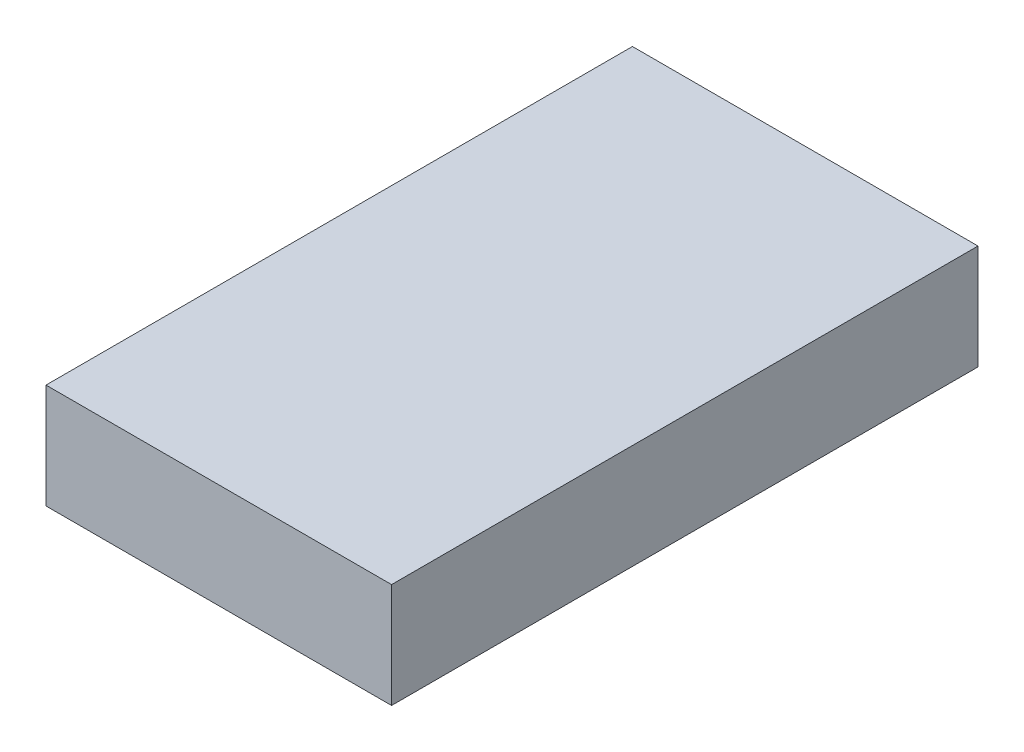
ISO-10303-21;
HEADER;
FILE_DESCRIPTION(('STEP AP214'),'2;1');
FILE_NAME('part.step','',(''),(''),'','','');
FILE_SCHEMA(('AUTOMOTIVE_DESIGN { 1 0 10303 214 1 1 1 1 }'));
ENDSEC;
DATA;
#1=APPLICATION_CONTEXT('core data for automotive mechanical design processes');
#2=APPLICATION_PROTOCOL_DEFINITION('international standard','automotive_design',2000,#1);
#3=PRODUCT_CONTEXT('',#1,'mechanical');
#4=PRODUCT('Part','Part','',(#3));
#5=PRODUCT_RELATED_PRODUCT_CATEGORY('part','',(#4));
#6=PRODUCT_DEFINITION_FORMATION('','',#4);
#7=PRODUCT_DEFINITION_CONTEXT('part definition',#1,'design');
#8=PRODUCT_DEFINITION('design','',#6,#7);
#9=PRODUCT_DEFINITION_SHAPE('','',#8);
#10=(LENGTH_UNIT() NAMED_UNIT(*) SI_UNIT(.MILLI.,.METRE.));
#11=(NAMED_UNIT(*) PLANE_ANGLE_UNIT() SI_UNIT($,.RADIAN.));
#12=(NAMED_UNIT(*) SI_UNIT($,.STERADIAN.) SOLID_ANGLE_UNIT());
#13=UNCERTAINTY_MEASURE_WITH_UNIT(LENGTH_MEASURE(1.E-05),#10,'distance_accuracy_value','');
#14=(GEOMETRIC_REPRESENTATION_CONTEXT(3) GLOBAL_UNCERTAINTY_ASSIGNED_CONTEXT((#13)) GLOBAL_UNIT_ASSIGNED_CONTEXT((#10,
#11,#12)) REPRESENTATION_CONTEXT('',''));
#15=CARTESIAN_POINT('',(0.,0.,0.));
#16=DIRECTION('',(0.,0.,1.));
#17=DIRECTION('',(1.,0.,0.));
#18=AXIS2_PLACEMENT_3D('',#15,#16,#17);
#19=CARTESIAN_POINT('',(0.,6.35,0.));
#20=DIRECTION('',(1.,0.,0.));
#21=DIRECTION('',(0.,0.,-1.));
#22=AXIS2_PLACEMENT_3D('',#19,#20,#21);
#23=PLANE('',#22);
#24=DIRECTION('',(0.,0.,1.));
#25=VECTOR('',#24,1.);
#26=CARTESIAN_POINT('',(0.,0.,0.));
#27=LINE('',#26,#25);
#28=CARTESIAN_POINT('',(0.,0.,-35.56));
#29=VERTEX_POINT('',#28);
#30=CARTESIAN_POINT('',(0.,0.,0.));
#31=VERTEX_POINT('',#30);
#32=EDGE_CURVE('E103',#29,#31,#27,.T.);
#33=ORIENTED_EDGE('',*,*,#32,.T.);
#34=DIRECTION('',(0.,-1.,0.));
#35=VECTOR('',#34,1.);
#36=CARTESIAN_POINT('',(0.,6.35,0.));
#37=LINE('',#36,#35);
#38=CARTESIAN_POINT('',(0.,6.35,0.));
#39=VERTEX_POINT('',#38);
#40=EDGE_CURVE('E10',#39,#31,#37,.T.);
#41=ORIENTED_EDGE('',*,*,#40,.F.);
#42=DIRECTION('',(0.,0.,1.));
#43=VECTOR('',#42,1.);
#44=CARTESIAN_POINT('',(0.,6.35,0.));
#45=LINE('',#44,#43);
#46=CARTESIAN_POINT('',(0.,6.35,-35.56));
#47=VERTEX_POINT('',#46);
#48=EDGE_CURVE('E83',#47,#39,#45,.T.);
#49=ORIENTED_EDGE('',*,*,#48,.F.);
#50=DIRECTION('',(0.,-1.,0.));
#51=VECTOR('',#50,1.);
#52=CARTESIAN_POINT('',(0.,6.35,-35.56));
#53=LINE('',#52,#51);
#54=EDGE_CURVE('E99',#47,#29,#53,.T.);
#55=ORIENTED_EDGE('',*,*,#54,.T.);
#56=EDGE_LOOP('',(#33,#41,#49,#55));
#57=FACE_BOUND('',#56,.T.);
#58=ADVANCED_FACE('F16',(#57),#23,.F.);
#59=CARTESIAN_POINT('',(0.,6.35,0.));
#60=DIRECTION('',(0.,0.,-1.));
#61=DIRECTION('',(-1.,0.,0.));
#62=AXIS2_PLACEMENT_3D('',#59,#60,#61);
#63=PLANE('',#62);
#64=DIRECTION('',(1.,0.,0.));
#65=VECTOR('',#64,1.);
#66=CARTESIAN_POINT('',(0.,0.,0.));
#67=LINE('',#66,#65);
#68=CARTESIAN_POINT('',(20.955,0.,0.));
#69=VERTEX_POINT('',#68);
#70=EDGE_CURVE('E88',#31,#69,#67,.T.);
#71=ORIENTED_EDGE('',*,*,#70,.T.);
#72=DIRECTION('',(0.,-1.,0.));
#73=VECTOR('',#72,1.);
#74=CARTESIAN_POINT('',(20.955,6.35,0.));
#75=LINE('',#74,#73);
#76=CARTESIAN_POINT('',(20.955,6.35,0.));
#77=VERTEX_POINT('',#76);
#78=EDGE_CURVE('E25',#77,#69,#75,.T.);
#79=ORIENTED_EDGE('',*,*,#78,.F.);
#80=DIRECTION('',(1.,0.,0.));
#81=VECTOR('',#80,1.);
#82=CARTESIAN_POINT('',(0.,6.35,0.));
#83=LINE('',#82,#81);
#84=EDGE_CURVE('E77',#39,#77,#83,.T.);
#85=ORIENTED_EDGE('',*,*,#84,.F.);
#86=ORIENTED_EDGE('',*,*,#40,.T.);
#87=EDGE_LOOP('',(#71,#79,#85,#86));
#88=FACE_BOUND('',#87,.T.);
#89=ADVANCED_FACE('F87',(#88),#63,.F.);
#90=CARTESIAN_POINT('',(20.955,6.35,0.));
#91=DIRECTION('',(-1.,0.,0.));
#92=DIRECTION('',(0.,0.,1.));
#93=AXIS2_PLACEMENT_3D('',#90,#91,#92);
#94=PLANE('',#93);
#95=DIRECTION('',(0.,0.,-1.));
#96=VECTOR('',#95,1.);
#97=CARTESIAN_POINT('',(20.955,0.,0.));
#98=LINE('',#97,#96);
#99=CARTESIAN_POINT('',(20.955,0.,-35.56));
#100=VERTEX_POINT('',#99);
#101=EDGE_CURVE('E60',#69,#100,#98,.T.);
#102=ORIENTED_EDGE('',*,*,#101,.T.);
#103=DIRECTION('',(0.,-1.,0.));
#104=VECTOR('',#103,1.);
#105=CARTESIAN_POINT('',(20.955,6.35,-35.56));
#106=LINE('',#105,#104);
#107=CARTESIAN_POINT('',(20.955,6.35,-35.56));
#108=VERTEX_POINT('',#107);
#109=EDGE_CURVE('E90',#108,#100,#106,.T.);
#110=ORIENTED_EDGE('',*,*,#109,.F.);
#111=DIRECTION('',(0.,0.,-1.));
#112=VECTOR('',#111,1.);
#113=CARTESIAN_POINT('',(20.955,6.35,0.));
#114=LINE('',#113,#112);
#115=EDGE_CURVE('E81',#77,#108,#114,.T.);
#116=ORIENTED_EDGE('',*,*,#115,.F.);
#117=ORIENTED_EDGE('',*,*,#78,.T.);
#118=EDGE_LOOP('',(#102,#110,#116,#117));
#119=FACE_BOUND('',#118,.T.);
#120=ADVANCED_FACE('F91',(#119),#94,.F.);
#121=CARTESIAN_POINT('',(0.,6.35,-35.56));
#122=DIRECTION('',(0.,0.,1.));
#123=DIRECTION('',(1.,0.,0.));
#124=AXIS2_PLACEMENT_3D('',#121,#122,#123);
#125=PLANE('',#124);
#126=DIRECTION('',(-1.,0.,0.));
#127=VECTOR('',#126,1.);
#128=CARTESIAN_POINT('',(0.,0.,-35.56));
#129=LINE('',#128,#127);
#130=EDGE_CURVE('E68',#100,#29,#129,.T.);
#131=ORIENTED_EDGE('',*,*,#130,.T.);
#132=ORIENTED_EDGE('',*,*,#54,.F.);
#133=DIRECTION('',(-1.,0.,0.));
#134=VECTOR('',#133,1.);
#135=CARTESIAN_POINT('',(0.,6.35,-35.56));
#136=LINE('',#135,#134);
#137=EDGE_CURVE('E38',#108,#47,#136,.T.);
#138=ORIENTED_EDGE('',*,*,#137,.F.);
#139=ORIENTED_EDGE('',*,*,#109,.T.);
#140=EDGE_LOOP('',(#131,#132,#138,#139));
#141=FACE_BOUND('',#140,.T.);
#142=ADVANCED_FACE('F119',(#141),#125,.F.);
#143=CARTESIAN_POINT('',(0.,6.35,0.));
#144=DIRECTION('',(0.,-1.,0.));
#145=DIRECTION('',(0.,0.,-1.));
#146=AXIS2_PLACEMENT_3D('',#143,#144,#145);
#147=PLANE('',#146);
#148=ORIENTED_EDGE('',*,*,#48,.T.);
#149=ORIENTED_EDGE('',*,*,#84,.T.);
#150=ORIENTED_EDGE('',*,*,#115,.T.);
#151=ORIENTED_EDGE('',*,*,#137,.T.);
#152=EDGE_LOOP('',(#148,#149,#150,#151));
#153=FACE_BOUND('',#152,.T.);
#154=ADVANCED_FACE('F79',(#153),#147,.F.);
#155=CARTESIAN_POINT('',(0.,0.,0.));
#156=DIRECTION('',(0.,-1.,0.));
#157=DIRECTION('',(0.,0.,-1.));
#158=AXIS2_PLACEMENT_3D('',#155,#156,#157);
#159=PLANE('',#158);
#160=ORIENTED_EDGE('',*,*,#32,.F.);
#161=ORIENTED_EDGE('',*,*,#130,.F.);
#162=ORIENTED_EDGE('',*,*,#101,.F.);
#163=ORIENTED_EDGE('',*,*,#70,.F.);
#164=EDGE_LOOP('',(#160,#161,#162,#163));
#165=FACE_BOUND('',#164,.T.);
#166=ADVANCED_FACE('F122',(#165),#159,.T.);
#167=CLOSED_SHELL('',(#58,#89,#120,#142,#154,#166));
#168=MANIFOLD_SOLID_BREP('B1',#167);
#169=ADVANCED_BREP_SHAPE_REPRESENTATION('',(#18,#168),#14);
#170=SHAPE_DEFINITION_REPRESENTATION(#9,#169);
ENDSEC;
END-ISO-10303-21;
